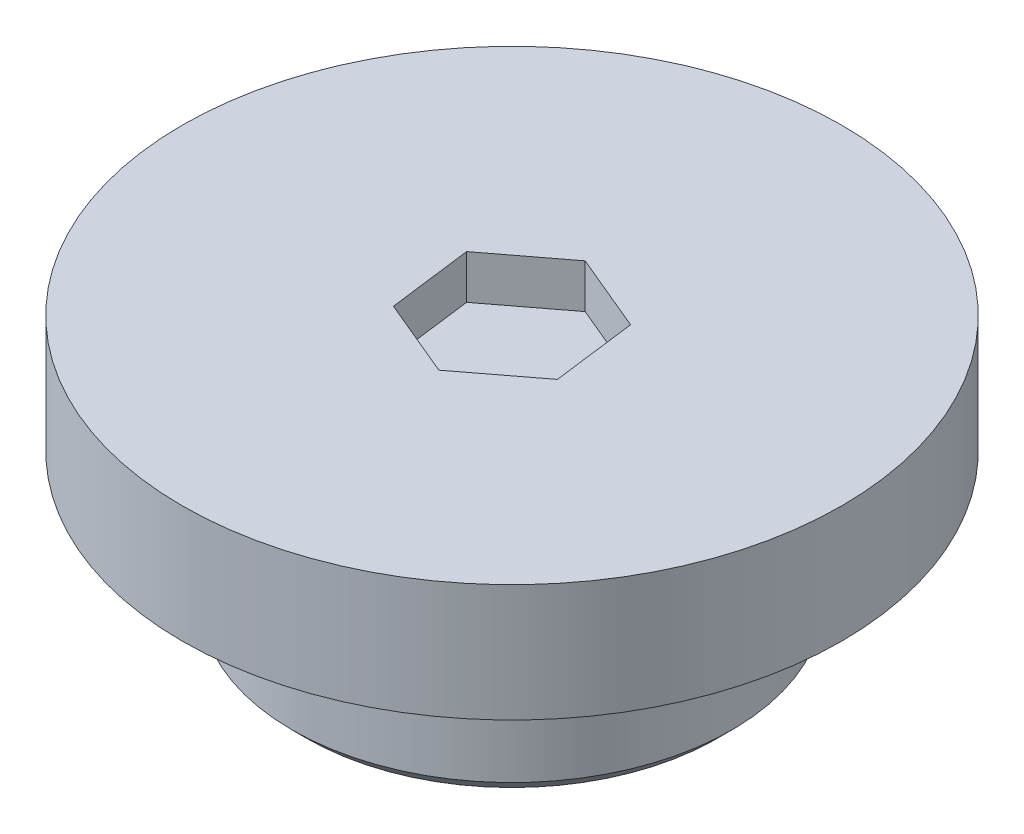
ISO-10303-21;
HEADER;
FILE_DESCRIPTION(('STEP AP214'),'2;1');
FILE_NAME('part.step','',(''),(''),'','','');
FILE_SCHEMA(('AUTOMOTIVE_DESIGN { 1 0 10303 214 1 1 1 1 }'));
ENDSEC;
DATA;
#1=APPLICATION_CONTEXT('core data for automotive mechanical design processes');
#2=APPLICATION_PROTOCOL_DEFINITION('international standard','automotive_design',2000,#1);
#3=PRODUCT_CONTEXT('',#1,'mechanical');
#4=PRODUCT('Part','Part','',(#3));
#5=PRODUCT_RELATED_PRODUCT_CATEGORY('part','',(#4));
#6=PRODUCT_DEFINITION_FORMATION('','',#4);
#7=PRODUCT_DEFINITION_CONTEXT('part definition',#1,'design');
#8=PRODUCT_DEFINITION('design','',#6,#7);
#9=PRODUCT_DEFINITION_SHAPE('','',#8);
#10=(LENGTH_UNIT() NAMED_UNIT(*) SI_UNIT(.MILLI.,.METRE.));
#11=(NAMED_UNIT(*) PLANE_ANGLE_UNIT() SI_UNIT($,.RADIAN.));
#12=(NAMED_UNIT(*) SI_UNIT($,.STERADIAN.) SOLID_ANGLE_UNIT());
#13=UNCERTAINTY_MEASURE_WITH_UNIT(LENGTH_MEASURE(1.E-05),#10,'distance_accuracy_value','');
#14=(GEOMETRIC_REPRESENTATION_CONTEXT(3) GLOBAL_UNCERTAINTY_ASSIGNED_CONTEXT((#13)) GLOBAL_UNIT_ASSIGNED_CONTEXT((#10,
#11,#12)) REPRESENTATION_CONTEXT('',''));
#15=CARTESIAN_POINT('',(0.,0.,0.));
#16=DIRECTION('',(0.,0.,1.));
#17=DIRECTION('',(1.,0.,0.));
#18=AXIS2_PLACEMENT_3D('',#15,#16,#17);
#19=CARTESIAN_POINT('',(0.,10.,0.));
#20=DIRECTION('',(0.,-1.,0.));
#21=DIRECTION('',(0.,0.,-1.));
#22=AXIS2_PLACEMENT_3D('',#19,#20,#21);
#23=CYLINDRICAL_SURFACE('',#22,15.);
#24=CARTESIAN_POINT('',(0.,1.00000000000001,0.));
#25=DIRECTION('',(0.,1.,0.));
#26=DIRECTION('',(0.,0.,1.));
#27=AXIS2_PLACEMENT_3D('',#24,#25,#26);
#28=CIRCLE('',#27,15.);
#29=CARTESIAN_POINT('',(0.,1.00000000000001,15.));
#30=VERTEX_POINT('',#29);
#31=EDGE_CURVE('E158',#30,#30,#28,.T.);
#32=ORIENTED_EDGE('',*,*,#31,.T.);
#33=EDGE_LOOP('',(#32));
#34=FACE_BOUND('',#33,.T.);
#35=CARTESIAN_POINT('',(0.,10.,0.));
#36=DIRECTION('',(0.,1.,0.));
#37=DIRECTION('',(0.,0.,1.));
#38=AXIS2_PLACEMENT_3D('',#35,#36,#37);
#39=CIRCLE('',#38,15.);
#40=CARTESIAN_POINT('',(0.,10.,15.));
#41=VERTEX_POINT('',#40);
#42=EDGE_CURVE('E153',#41,#41,#39,.T.);
#43=ORIENTED_EDGE('',*,*,#42,.F.);
#44=EDGE_LOOP('',(#43));
#45=FACE_BOUND('',#44,.T.);
#46=ADVANCED_FACE('F38',(#34,#45),#23,.T.);
#47=CARTESIAN_POINT('',(0.,0.,0.));
#48=DIRECTION('',(0.,1.,0.));
#49=DIRECTION('',(0.,0.,1.));
#50=AXIS2_PLACEMENT_3D('',#47,#48,#49);
#51=PLANE('',#50);
#52=CARTESIAN_POINT('',(0.,0.,0.));
#53=DIRECTION('',(0.,1.,0.));
#54=DIRECTION('',(0.,0.,1.));
#55=AXIS2_PLACEMENT_3D('',#52,#53,#54);
#56=CIRCLE('',#55,11.);
#57=CARTESIAN_POINT('',(0.,0.,11.));
#58=VERTEX_POINT('',#57);
#59=EDGE_CURVE('E11',#58,#58,#56,.T.);
#60=ORIENTED_EDGE('',*,*,#59,.T.);
#61=EDGE_LOOP('',(#60));
#62=FACE_BOUND('',#61,.T.);
#63=CARTESIAN_POINT('',(0.,0.,0.));
#64=DIRECTION('',(0.,1.,0.));
#65=DIRECTION('',(0.,0.,1.));
#66=AXIS2_PLACEMENT_3D('',#63,#64,#65);
#67=CIRCLE('',#66,14.);
#68=CARTESIAN_POINT('',(0.,0.,14.));
#69=VERTEX_POINT('',#68);
#70=EDGE_CURVE('E161',#69,#69,#67,.F.);
#71=ORIENTED_EDGE('',*,*,#70,.T.);
#72=EDGE_LOOP('',(#71));
#73=FACE_BOUND('',#72,.T.);
#74=ADVANCED_FACE('F178',(#62,#73),#51,.F.);
#75=CARTESIAN_POINT('',(0.,18.,0.));
#76=DIRECTION('',(0.,-1.,0.));
#77=DIRECTION('',(0.,0.,-1.));
#78=AXIS2_PLACEMENT_3D('',#75,#76,#77);
#79=CYLINDRICAL_SURFACE('',#78,22.5);
#80=CARTESIAN_POINT('',(0.,18.,0.));
#81=DIRECTION('',(0.,1.,0.));
#82=DIRECTION('',(0.,0.,1.));
#83=AXIS2_PLACEMENT_3D('',#80,#81,#82);
#84=CIRCLE('',#83,22.5);
#85=CARTESIAN_POINT('',(0.,18.,22.5));
#86=VERTEX_POINT('',#85);
#87=EDGE_CURVE('E150',#86,#86,#84,.T.);
#88=ORIENTED_EDGE('',*,*,#87,.F.);
#89=EDGE_LOOP('',(#88));
#90=FACE_BOUND('',#89,.T.);
#91=CARTESIAN_POINT('',(0.,10.,0.));
#92=DIRECTION('',(0.,1.,0.));
#93=DIRECTION('',(0.,0.,1.));
#94=AXIS2_PLACEMENT_3D('',#91,#92,#93);
#95=CIRCLE('',#94,22.5);
#96=CARTESIAN_POINT('',(0.,10.,22.5));
#97=VERTEX_POINT('',#96);
#98=EDGE_CURVE('E149',#97,#97,#95,.T.);
#99=ORIENTED_EDGE('',*,*,#98,.T.);
#100=EDGE_LOOP('',(#99));
#101=FACE_BOUND('',#100,.T.);
#102=ADVANCED_FACE('F184',(#90,#101),#79,.T.);
#103=CARTESIAN_POINT('',(0.,18.,0.));
#104=DIRECTION('',(0.,1.,0.));
#105=DIRECTION('',(0.,0.,1.));
#106=AXIS2_PLACEMENT_3D('',#103,#104,#105);
#107=PLANE('',#106);
#108=DIRECTION('',(0.795497151131333,0.,-0.605957327327538));
#109=VECTOR('',#108,1.);
#110=CARTESIAN_POINT('',(0.73338416491141,18.,5.72673388590657));
#111=LINE('',#110,#109);
#112=CARTESIAN_POINT('',(0.73338416491141,18.,5.72673388590657));
#113=VERTEX_POINT('',#112);
#114=CARTESIAN_POINT('',(5.32618910836397,18.,2.22823762540676));
#115=VERTEX_POINT('',#114);
#116=EDGE_CURVE('E54',#113,#115,#111,.T.);
#117=ORIENTED_EDGE('',*,*,#116,.F.);
#118=DIRECTION('',(0.922523014640637,0.,0.385942077854114));
#119=VECTOR('',#118,1.);
#120=CARTESIAN_POINT('',(-4.59280494345256,18.,3.49849626049981));
#121=LINE('',#120,#119);
#122=CARTESIAN_POINT('',(-4.59280494345256,18.,3.49849626049981));
#123=VERTEX_POINT('',#122);
#124=EDGE_CURVE('E137',#123,#113,#121,.T.);
#125=ORIENTED_EDGE('',*,*,#124,.F.);
#126=DIRECTION('',(0.127025863509304,0.,0.991899405181652));
#127=VECTOR('',#126,1.);
#128=CARTESIAN_POINT('',(-5.32618910836397,18.,-2.22823762540676));
#129=LINE('',#128,#127);
#130=CARTESIAN_POINT('',(-5.32618910836397,18.,-2.22823762540676));
#131=VERTEX_POINT('',#130);
#132=EDGE_CURVE('E135',#131,#123,#129,.T.);
#133=ORIENTED_EDGE('',*,*,#132,.F.);
#134=DIRECTION('',(-0.795497151131333,0.,0.605957327327538));
#135=VECTOR('',#134,1.);
#136=CARTESIAN_POINT('',(-0.733384164911411,18.,-5.72673388590657));
#137=LINE('',#136,#135);
#138=CARTESIAN_POINT('',(-0.733384164911411,18.,-5.72673388590657));
#139=VERTEX_POINT('',#138);
#140=EDGE_CURVE('E102',#139,#131,#137,.T.);
#141=ORIENTED_EDGE('',*,*,#140,.F.);
#142=DIRECTION('',(-0.922523014640637,0.,-0.385942077854114));
#143=VECTOR('',#142,1.);
#144=CARTESIAN_POINT('',(4.59280494345256,18.,-3.49849626049981));
#145=LINE('',#144,#143);
#146=CARTESIAN_POINT('',(4.59280494345256,18.,-3.49849626049981));
#147=VERTEX_POINT('',#146);
#148=EDGE_CURVE('E131',#147,#139,#145,.T.);
#149=ORIENTED_EDGE('',*,*,#148,.F.);
#150=DIRECTION('',(-0.127025863509304,0.,-0.991899405181652));
#151=VECTOR('',#150,1.);
#152=CARTESIAN_POINT('',(5.32618910836397,18.,2.22823762540676));
#153=LINE('',#152,#151);
#154=EDGE_CURVE('E128',#115,#147,#153,.T.);
#155=ORIENTED_EDGE('',*,*,#154,.F.);
#156=EDGE_LOOP('',(#117,#125,#133,#141,#149,#155));
#157=FACE_BOUND('',#156,.T.);
#158=ORIENTED_EDGE('',*,*,#87,.T.);
#159=EDGE_LOOP('',(#158));
#160=FACE_BOUND('',#159,.T.);
#161=ADVANCED_FACE('F203',(#157,#160),#107,.T.);
#162=CARTESIAN_POINT('',(0.,10.,0.));
#163=DIRECTION('',(0.,1.,0.));
#164=DIRECTION('',(0.,0.,1.));
#165=AXIS2_PLACEMENT_3D('',#162,#163,#164);
#166=PLANE('',#165);
#167=ORIENTED_EDGE('',*,*,#42,.T.);
#168=EDGE_LOOP('',(#167));
#169=FACE_BOUND('',#168,.T.);
#170=ORIENTED_EDGE('',*,*,#98,.F.);
#171=EDGE_LOOP('',(#170));
#172=FACE_BOUND('',#171,.T.);
#173=ADVANCED_FACE('F195',(#169,#172),#166,.F.);
#174=CARTESIAN_POINT('',(0.,1.00000000000001,0.));
#175=DIRECTION('',(0.,1.,0.));
#176=DIRECTION('',(0.,0.,1.));
#177=AXIS2_PLACEMENT_3D('',#174,#175,#176);
#178=CONICAL_SURFACE('',#177,15.,0.78539816339745);
#179=ORIENTED_EDGE('',*,*,#70,.F.);
#180=EDGE_LOOP('',(#179));
#181=FACE_BOUND('',#180,.T.);
#182=ORIENTED_EDGE('',*,*,#31,.F.);
#183=EDGE_LOOP('',(#182));
#184=FACE_BOUND('',#183,.T.);
#185=ADVANCED_FACE('F190',(#181,#184),#178,.T.);
#186=CARTESIAN_POINT('',(0.,10.,0.));
#187=DIRECTION('',(0.,1.,0.));
#188=DIRECTION('',(0.,0.,1.));
#189=AXIS2_PLACEMENT_3D('',#186,#187,#188);
#190=PLANE('',#189);
#191=CARTESIAN_POINT('',(0.,10.,0.));
#192=DIRECTION('',(0.,1.,0.));
#193=DIRECTION('',(0.,0.,1.));
#194=AXIS2_PLACEMENT_3D('',#191,#192,#193);
#195=CIRCLE('',#194,10.);
#196=CARTESIAN_POINT('',(0.,10.,10.));
#197=VERTEX_POINT('',#196);
#198=EDGE_CURVE('E141',#197,#197,#195,.F.);
#199=ORIENTED_EDGE('',*,*,#198,.T.);
#200=EDGE_LOOP('',(#199));
#201=FACE_BOUND('',#200,.T.);
#202=ADVANCED_FACE('F194',(#201),#190,.F.);
#203=CARTESIAN_POINT('',(0.,38.2842712474619,0.));
#204=DIRECTION('',(0.,-1.,0.));
#205=DIRECTION('',(0.,0.,-1.));
#206=AXIS2_PLACEMENT_3D('',#203,#204,#205);
#207=CYLINDRICAL_SURFACE('',#206,10.);
#208=CARTESIAN_POINT('',(0.,1.00000000000001,0.));
#209=DIRECTION('',(0.,1.,0.));
#210=DIRECTION('',(0.,0.,1.));
#211=AXIS2_PLACEMENT_3D('',#208,#209,#210);
#212=CIRCLE('',#211,10.);
#213=CARTESIAN_POINT('',(0.,1.00000000000001,10.));
#214=VERTEX_POINT('',#213);
#215=EDGE_CURVE('E47',#214,#214,#212,.F.);
#216=ORIENTED_EDGE('',*,*,#215,.T.);
#217=EDGE_LOOP('',(#216));
#218=FACE_BOUND('',#217,.T.);
#219=ORIENTED_EDGE('',*,*,#198,.F.);
#220=EDGE_LOOP('',(#219));
#221=FACE_BOUND('',#220,.T.);
#222=ADVANCED_FACE('F166',(#218,#221),#207,.F.);
#223=CARTESIAN_POINT('',(0.73338416491141,15.,5.72673388590657));
#224=DIRECTION('',(0.605957327327538,0.,0.795497151131333));
#225=DIRECTION('',(0.795497151131333,0.,-0.605957327327538));
#226=AXIS2_PLACEMENT_3D('',#223,#224,#225);
#227=PLANE('',#226);
#228=ORIENTED_EDGE('',*,*,#116,.T.);
#229=DIRECTION('',(0.,1.,0.));
#230=VECTOR('',#229,1.);
#231=CARTESIAN_POINT('',(5.32618910836397,15.,2.22823762540676));
#232=LINE('',#231,#230);
#233=CARTESIAN_POINT('',(5.32618910836397,15.,2.22823762540676));
#234=VERTEX_POINT('',#233);
#235=EDGE_CURVE('E84',#234,#115,#232,.T.);
#236=ORIENTED_EDGE('',*,*,#235,.F.);
#237=DIRECTION('',(0.795497151131333,0.,-0.605957327327538));
#238=VECTOR('',#237,1.);
#239=CARTESIAN_POINT('',(0.73338416491141,15.,5.72673388590657));
#240=LINE('',#239,#238);
#241=CARTESIAN_POINT('',(0.73338416491141,15.,5.72673388590657));
#242=VERTEX_POINT('',#241);
#243=EDGE_CURVE('E139',#242,#234,#240,.T.);
#244=ORIENTED_EDGE('',*,*,#243,.F.);
#245=DIRECTION('',(0.,1.,0.));
#246=VECTOR('',#245,1.);
#247=CARTESIAN_POINT('',(0.73338416491141,15.,5.72673388590657));
#248=LINE('',#247,#246);
#249=EDGE_CURVE('E62',#242,#113,#248,.T.);
#250=ORIENTED_EDGE('',*,*,#249,.T.);
#251=EDGE_LOOP('',(#228,#236,#244,#250));
#252=FACE_BOUND('',#251,.T.);
#253=ADVANCED_FACE('F239',(#252),#227,.F.);
#254=CARTESIAN_POINT('',(-4.59280494345256,15.,3.49849626049981));
#255=DIRECTION('',(-0.385942077854114,0.,0.922523014640637));
#256=DIRECTION('',(0.922523014640637,0.,0.385942077854114));
#257=AXIS2_PLACEMENT_3D('',#254,#255,#256);
#258=PLANE('',#257);
#259=ORIENTED_EDGE('',*,*,#124,.T.);
#260=ORIENTED_EDGE('',*,*,#249,.F.);
#261=DIRECTION('',(0.922523014640637,0.,0.385942077854114));
#262=VECTOR('',#261,1.);
#263=CARTESIAN_POINT('',(-4.59280494345256,15.,3.49849626049981));
#264=LINE('',#263,#262);
#265=CARTESIAN_POINT('',(-4.59280494345256,15.,3.49849626049981));
#266=VERTEX_POINT('',#265);
#267=EDGE_CURVE('E114',#266,#242,#264,.T.);
#268=ORIENTED_EDGE('',*,*,#267,.F.);
#269=DIRECTION('',(0.,1.,0.));
#270=VECTOR('',#269,1.);
#271=CARTESIAN_POINT('',(-4.59280494345256,15.,3.49849626049981));
#272=LINE('',#271,#270);
#273=EDGE_CURVE('E106',#266,#123,#272,.T.);
#274=ORIENTED_EDGE('',*,*,#273,.T.);
#275=EDGE_LOOP('',(#259,#260,#268,#274));
#276=FACE_BOUND('',#275,.T.);
#277=ADVANCED_FACE('F244',(#276),#258,.F.);
#278=CARTESIAN_POINT('',(-5.32618910836397,15.,-2.22823762540676));
#279=DIRECTION('',(-0.991899405181652,0.,0.127025863509304));
#280=DIRECTION('',(0.127025863509304,0.,0.991899405181652));
#281=AXIS2_PLACEMENT_3D('',#278,#279,#280);
#282=PLANE('',#281);
#283=ORIENTED_EDGE('',*,*,#132,.T.);
#284=ORIENTED_EDGE('',*,*,#273,.F.);
#285=DIRECTION('',(0.127025863509304,0.,0.991899405181652));
#286=VECTOR('',#285,1.);
#287=CARTESIAN_POINT('',(-5.32618910836397,15.,-2.22823762540676));
#288=LINE('',#287,#286);
#289=CARTESIAN_POINT('',(-5.32618910836397,15.,-2.22823762540676));
#290=VERTEX_POINT('',#289);
#291=EDGE_CURVE('E110',#290,#266,#288,.T.);
#292=ORIENTED_EDGE('',*,*,#291,.F.);
#293=DIRECTION('',(0.,1.,0.));
#294=VECTOR('',#293,1.);
#295=CARTESIAN_POINT('',(-5.32618910836397,15.,-2.22823762540676));
#296=LINE('',#295,#294);
#297=EDGE_CURVE('E95',#290,#131,#296,.T.);
#298=ORIENTED_EDGE('',*,*,#297,.T.);
#299=EDGE_LOOP('',(#283,#284,#292,#298));
#300=FACE_BOUND('',#299,.T.);
#301=ADVANCED_FACE('F111',(#300),#282,.F.);
#302=CARTESIAN_POINT('',(-0.733384164911411,15.,-5.72673388590657));
#303=DIRECTION('',(-0.605957327327538,0.,-0.795497151131333));
#304=DIRECTION('',(-0.795497151131333,0.,0.605957327327538));
#305=AXIS2_PLACEMENT_3D('',#302,#303,#304);
#306=PLANE('',#305);
#307=ORIENTED_EDGE('',*,*,#140,.T.);
#308=ORIENTED_EDGE('',*,*,#297,.F.);
#309=DIRECTION('',(-0.795497151131333,0.,0.605957327327538));
#310=VECTOR('',#309,1.);
#311=CARTESIAN_POINT('',(-0.733384164911411,15.,-5.72673388590657));
#312=LINE('',#311,#310);
#313=CARTESIAN_POINT('',(-0.733384164911411,15.,-5.72673388590657));
#314=VERTEX_POINT('',#313);
#315=EDGE_CURVE('E99',#314,#290,#312,.T.);
#316=ORIENTED_EDGE('',*,*,#315,.F.);
#317=DIRECTION('',(0.,1.,0.));
#318=VECTOR('',#317,1.);
#319=CARTESIAN_POINT('',(-0.733384164911411,15.,-5.72673388590657));
#320=LINE('',#319,#318);
#321=EDGE_CURVE('E107',#314,#139,#320,.T.);
#322=ORIENTED_EDGE('',*,*,#321,.T.);
#323=EDGE_LOOP('',(#307,#308,#316,#322));
#324=FACE_BOUND('',#323,.T.);
#325=ADVANCED_FACE('F97',(#324),#306,.F.);
#326=CARTESIAN_POINT('',(4.59280494345256,15.,-3.49849626049981));
#327=DIRECTION('',(0.385942077854114,0.,-0.922523014640637));
#328=DIRECTION('',(-0.922523014640637,0.,-0.385942077854114));
#329=AXIS2_PLACEMENT_3D('',#326,#327,#328);
#330=PLANE('',#329);
#331=ORIENTED_EDGE('',*,*,#148,.T.);
#332=ORIENTED_EDGE('',*,*,#321,.F.);
#333=DIRECTION('',(-0.922523014640637,0.,-0.385942077854114));
#334=VECTOR('',#333,1.);
#335=CARTESIAN_POINT('',(4.59280494345256,15.,-3.49849626049981));
#336=LINE('',#335,#334);
#337=CARTESIAN_POINT('',(4.59280494345256,15.,-3.49849626049981));
#338=VERTEX_POINT('',#337);
#339=EDGE_CURVE('E120',#338,#314,#336,.T.);
#340=ORIENTED_EDGE('',*,*,#339,.F.);
#341=DIRECTION('',(0.,1.,0.));
#342=VECTOR('',#341,1.);
#343=CARTESIAN_POINT('',(4.59280494345256,15.,-3.49849626049981));
#344=LINE('',#343,#342);
#345=EDGE_CURVE('E144',#338,#147,#344,.T.);
#346=ORIENTED_EDGE('',*,*,#345,.T.);
#347=EDGE_LOOP('',(#331,#332,#340,#346));
#348=FACE_BOUND('',#347,.T.);
#349=ADVANCED_FACE('F271',(#348),#330,.F.);
#350=CARTESIAN_POINT('',(5.32618910836397,15.,2.22823762540676));
#351=DIRECTION('',(0.991899405181652,0.,-0.127025863509304));
#352=DIRECTION('',(-0.127025863509304,0.,-0.991899405181652));
#353=AXIS2_PLACEMENT_3D('',#350,#351,#352);
#354=PLANE('',#353);
#355=ORIENTED_EDGE('',*,*,#154,.T.);
#356=ORIENTED_EDGE('',*,*,#345,.F.);
#357=DIRECTION('',(-0.127025863509304,0.,-0.991899405181652));
#358=VECTOR('',#357,1.);
#359=CARTESIAN_POINT('',(5.32618910836397,15.,2.22823762540676));
#360=LINE('',#359,#358);
#361=EDGE_CURVE('E122',#234,#338,#360,.T.);
#362=ORIENTED_EDGE('',*,*,#361,.F.);
#363=ORIENTED_EDGE('',*,*,#235,.T.);
#364=EDGE_LOOP('',(#355,#356,#362,#363));
#365=FACE_BOUND('',#364,.T.);
#366=ADVANCED_FACE('F174',(#365),#354,.F.);
#367=CARTESIAN_POINT('',(0.,15.,0.));
#368=DIRECTION('',(0.,1.,0.));
#369=DIRECTION('',(0.,0.,1.));
#370=AXIS2_PLACEMENT_3D('',#367,#368,#369);
#371=PLANE('',#370);
#372=ORIENTED_EDGE('',*,*,#243,.T.);
#373=ORIENTED_EDGE('',*,*,#361,.T.);
#374=ORIENTED_EDGE('',*,*,#339,.T.);
#375=ORIENTED_EDGE('',*,*,#315,.T.);
#376=ORIENTED_EDGE('',*,*,#291,.T.);
#377=ORIENTED_EDGE('',*,*,#267,.T.);
#378=EDGE_LOOP('',(#372,#373,#374,#375,#376,#377));
#379=FACE_BOUND('',#378,.T.);
#380=ADVANCED_FACE('F117',(#379),#371,.T.);
#381=CARTESIAN_POINT('',(0.,1.00000000000001,0.));
#382=DIRECTION('',(0.,-1.,0.));
#383=DIRECTION('',(0.,0.,-1.));
#384=AXIS2_PLACEMENT_3D('',#381,#382,#383);
#385=CONICAL_SURFACE('',#384,10.,0.785398163397449);
#386=ORIENTED_EDGE('',*,*,#59,.F.);
#387=EDGE_LOOP('',(#386));
#388=FACE_BOUND('',#387,.T.);
#389=ORIENTED_EDGE('',*,*,#215,.F.);
#390=EDGE_LOOP('',(#389));
#391=FACE_BOUND('',#390,.T.);
#392=ADVANCED_FACE('F41',(#388,#391),#385,.F.);
#393=CLOSED_SHELL('',(#46,#74,#102,#161,#173,#185,#202,#222,#253,#277,#301,#325,#349,#366,#380,#392));
#394=MANIFOLD_SOLID_BREP('B2',#393);
#395=ADVANCED_BREP_SHAPE_REPRESENTATION('',(#18,#394),#14);
#396=SHAPE_DEFINITION_REPRESENTATION(#9,#395);
ENDSEC;
END-ISO-10303-21;
